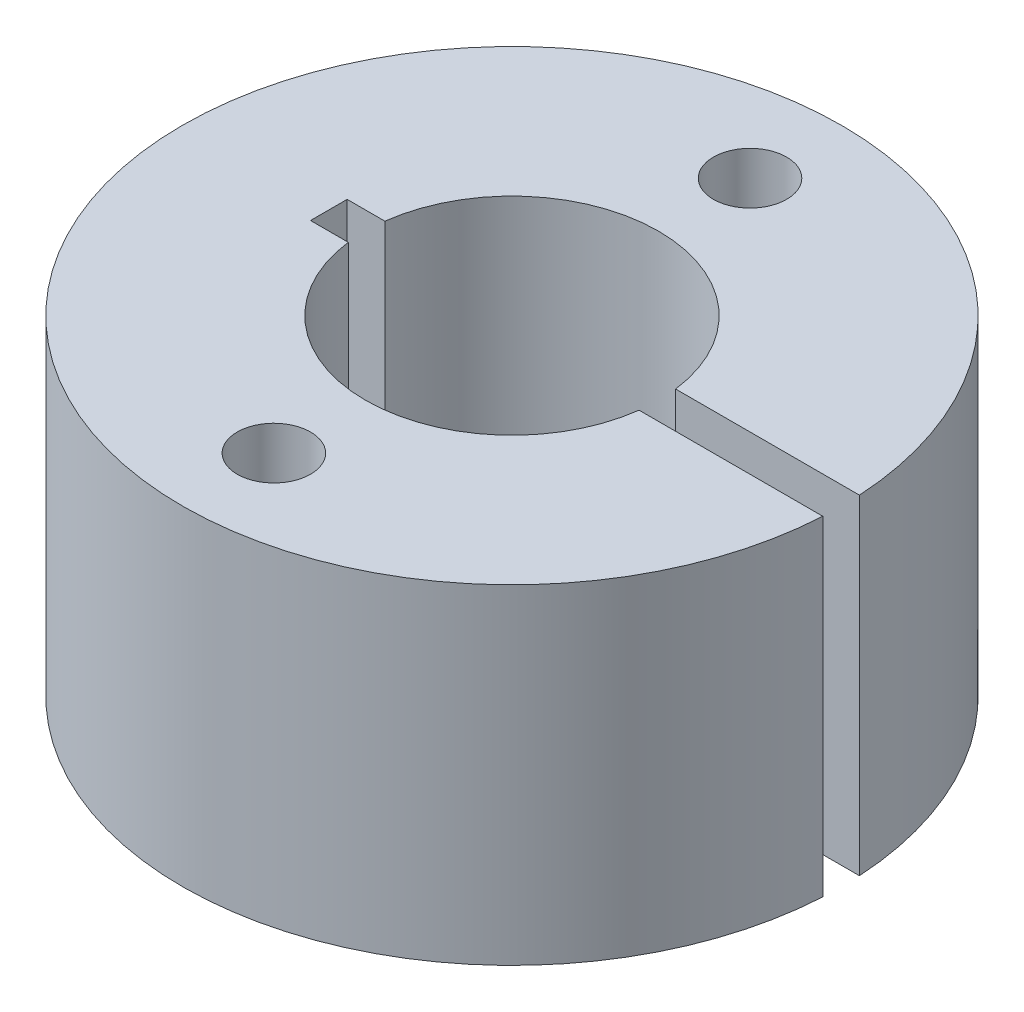
ISO-10303-21;
HEADER;
FILE_DESCRIPTION(('STEP AP214'),'2;1');
FILE_NAME('part.step','',(''),(''),'','','');
FILE_SCHEMA(('AUTOMOTIVE_DESIGN { 1 0 10303 214 1 1 1 1 }'));
ENDSEC;
DATA;
#1=APPLICATION_CONTEXT('core data for automotive mechanical design processes');
#2=APPLICATION_PROTOCOL_DEFINITION('international standard','automotive_design',2000,#1);
#3=PRODUCT_CONTEXT('',#1,'mechanical');
#4=PRODUCT('Part','Part','',(#3));
#5=PRODUCT_RELATED_PRODUCT_CATEGORY('part','',(#4));
#6=PRODUCT_DEFINITION_FORMATION('','',#4);
#7=PRODUCT_DEFINITION_CONTEXT('part definition',#1,'design');
#8=PRODUCT_DEFINITION('design','',#6,#7);
#9=PRODUCT_DEFINITION_SHAPE('','',#8);
#10=(LENGTH_UNIT() NAMED_UNIT(*) SI_UNIT(.MILLI.,.METRE.));
#11=(NAMED_UNIT(*) PLANE_ANGLE_UNIT() SI_UNIT($,.RADIAN.));
#12=(NAMED_UNIT(*) SI_UNIT($,.STERADIAN.) SOLID_ANGLE_UNIT());
#13=UNCERTAINTY_MEASURE_WITH_UNIT(LENGTH_MEASURE(1.E-05),#10,'distance_accuracy_value','');
#14=(GEOMETRIC_REPRESENTATION_CONTEXT(3) GLOBAL_UNCERTAINTY_ASSIGNED_CONTEXT((#13)) GLOBAL_UNIT_ASSIGNED_CONTEXT((#10,
#11,#12)) REPRESENTATION_CONTEXT('',''));
#15=CARTESIAN_POINT('',(0.,0.,0.));
#16=DIRECTION('',(0.,0.,1.));
#17=DIRECTION('',(1.,0.,0.));
#18=AXIS2_PLACEMENT_3D('',#15,#16,#17);
#19=CARTESIAN_POINT('',(0.,9.,0.));
#20=DIRECTION('',(0.,-1.,0.));
#21=DIRECTION('',(0.,0.,-1.));
#22=AXIS2_PLACEMENT_3D('',#19,#20,#21);
#23=CYLINDRICAL_SURFACE('',#22,4.);
#24=CARTESIAN_POINT('',(0.,0.,0.));
#25=DIRECTION('',(0.,-1.,0.));
#26=DIRECTION('',(0.,0.,1.));
#27=AXIS2_PLACEMENT_3D('',#24,#25,#26);
#28=CIRCLE('',#27,4.);
#29=CARTESIAN_POINT('',(3.96862696659689,0.,0.5));
#30=VERTEX_POINT('',#29);
#31=CARTESIAN_POINT('',(-3.96862696659689,0.,0.5));
#32=VERTEX_POINT('',#31);
#33=EDGE_CURVE('E129',#30,#32,#28,.T.);
#34=ORIENTED_EDGE('',*,*,#33,.T.);
#35=DIRECTION('',(0.,-1.,0.));
#36=VECTOR('',#35,1.);
#37=CARTESIAN_POINT('',(-3.96862696659689,9.,0.5));
#38=LINE('',#37,#36);
#39=CARTESIAN_POINT('',(-3.96862696659689,9.,0.5));
#40=VERTEX_POINT('',#39);
#41=EDGE_CURVE('E11',#40,#32,#38,.T.);
#42=ORIENTED_EDGE('',*,*,#41,.F.);
#43=CARTESIAN_POINT('',(0.,9.,0.));
#44=DIRECTION('',(0.,-1.,0.));
#45=DIRECTION('',(0.,0.,1.));
#46=AXIS2_PLACEMENT_3D('',#43,#44,#45);
#47=CIRCLE('',#46,4.);
#48=CARTESIAN_POINT('',(3.96862696659689,9.,0.5));
#49=VERTEX_POINT('',#48);
#50=EDGE_CURVE('E144',#49,#40,#47,.T.);
#51=ORIENTED_EDGE('',*,*,#50,.F.);
#52=DIRECTION('',(0.,-1.,0.));
#53=VECTOR('',#52,1.);
#54=CARTESIAN_POINT('',(3.96862696659689,9.,0.5));
#55=LINE('',#54,#53);
#56=EDGE_CURVE('E125',#49,#30,#55,.T.);
#57=ORIENTED_EDGE('',*,*,#56,.T.);
#58=EDGE_LOOP('',(#34,#42,#51,#57));
#59=FACE_BOUND('',#58,.T.);
#60=ADVANCED_FACE('F33',(#59),#23,.F.);
#61=CARTESIAN_POINT('',(-5.,9.,0.5));
#62=DIRECTION('',(0.,0.,1.));
#63=DIRECTION('',(1.,0.,0.));
#64=AXIS2_PLACEMENT_3D('',#61,#62,#63);
#65=PLANE('',#64);
#66=DIRECTION('',(-1.,0.,0.));
#67=VECTOR('',#66,1.);
#68=CARTESIAN_POINT('',(-5.,0.,0.5));
#69=LINE('',#68,#67);
#70=CARTESIAN_POINT('',(-5.,0.,0.5));
#71=VERTEX_POINT('',#70);
#72=EDGE_CURVE('E132',#32,#71,#69,.T.);
#73=ORIENTED_EDGE('',*,*,#72,.T.);
#74=DIRECTION('',(0.,-1.,0.));
#75=VECTOR('',#74,1.);
#76=CARTESIAN_POINT('',(-5.,9.,0.5));
#77=LINE('',#76,#75);
#78=CARTESIAN_POINT('',(-5.,9.,0.5));
#79=VERTEX_POINT('',#78);
#80=EDGE_CURVE('E41',#79,#71,#77,.T.);
#81=ORIENTED_EDGE('',*,*,#80,.F.);
#82=DIRECTION('',(-1.,0.,0.));
#83=VECTOR('',#82,1.);
#84=CARTESIAN_POINT('',(-5.,9.,0.5));
#85=LINE('',#84,#83);
#86=EDGE_CURVE('E92',#40,#79,#85,.T.);
#87=ORIENTED_EDGE('',*,*,#86,.F.);
#88=ORIENTED_EDGE('',*,*,#41,.T.);
#89=EDGE_LOOP('',(#73,#81,#87,#88));
#90=FACE_BOUND('',#89,.T.);
#91=ADVANCED_FACE('F213',(#90),#65,.F.);
#92=CARTESIAN_POINT('',(-5.,9.,-0.5));
#93=DIRECTION('',(-1.,0.,0.));
#94=DIRECTION('',(0.,0.,1.));
#95=AXIS2_PLACEMENT_3D('',#92,#93,#94);
#96=PLANE('',#95);
#97=DIRECTION('',(0.,0.,-1.));
#98=VECTOR('',#97,1.);
#99=CARTESIAN_POINT('',(-5.,0.,-0.5));
#100=LINE('',#99,#98);
#101=CARTESIAN_POINT('',(-5.,0.,-0.5));
#102=VERTEX_POINT('',#101);
#103=EDGE_CURVE('E135',#71,#102,#100,.T.);
#104=ORIENTED_EDGE('',*,*,#103,.T.);
#105=DIRECTION('',(0.,-1.,0.));
#106=VECTOR('',#105,1.);
#107=CARTESIAN_POINT('',(-5.,9.,-0.5));
#108=LINE('',#107,#106);
#109=CARTESIAN_POINT('',(-5.,9.,-0.5));
#110=VERTEX_POINT('',#109);
#111=EDGE_CURVE('E151',#110,#102,#108,.T.);
#112=ORIENTED_EDGE('',*,*,#111,.F.);
#113=DIRECTION('',(0.,0.,-1.));
#114=VECTOR('',#113,1.);
#115=CARTESIAN_POINT('',(-5.,9.,-0.5));
#116=LINE('',#115,#114);
#117=EDGE_CURVE('E159',#79,#110,#116,.T.);
#118=ORIENTED_EDGE('',*,*,#117,.F.);
#119=ORIENTED_EDGE('',*,*,#80,.T.);
#120=EDGE_LOOP('',(#104,#112,#118,#119));
#121=FACE_BOUND('',#120,.T.);
#122=ADVANCED_FACE('F157',(#121),#96,.F.);
#123=CARTESIAN_POINT('',(-5.,9.,-0.5));
#124=DIRECTION('',(0.,0.,-1.));
#125=DIRECTION('',(-1.,0.,0.));
#126=AXIS2_PLACEMENT_3D('',#123,#124,#125);
#127=PLANE('',#126);
#128=DIRECTION('',(1.,0.,0.));
#129=VECTOR('',#128,1.);
#130=CARTESIAN_POINT('',(-5.,0.,-0.5));
#131=LINE('',#130,#129);
#132=CARTESIAN_POINT('',(-3.96862696659689,0.,-0.500000000000001));
#133=VERTEX_POINT('',#132);
#134=EDGE_CURVE('E137',#102,#133,#131,.T.);
#135=ORIENTED_EDGE('',*,*,#134,.T.);
#136=DIRECTION('',(0.,-1.,0.));
#137=VECTOR('',#136,1.);
#138=CARTESIAN_POINT('',(-3.96862696659689,9.,-0.500000000000001));
#139=LINE('',#138,#137);
#140=CARTESIAN_POINT('',(-3.96862696659689,9.,-0.500000000000001));
#141=VERTEX_POINT('',#140);
#142=EDGE_CURVE('E148',#141,#133,#139,.T.);
#143=ORIENTED_EDGE('',*,*,#142,.F.);
#144=DIRECTION('',(1.,0.,0.));
#145=VECTOR('',#144,1.);
#146=CARTESIAN_POINT('',(-5.,9.,-0.5));
#147=LINE('',#146,#145);
#148=EDGE_CURVE('E171',#110,#141,#147,.T.);
#149=ORIENTED_EDGE('',*,*,#148,.F.);
#150=ORIENTED_EDGE('',*,*,#111,.T.);
#151=EDGE_LOOP('',(#135,#143,#149,#150));
#152=FACE_BOUND('',#151,.T.);
#153=ADVANCED_FACE('F167',(#152),#127,.F.);
#154=CARTESIAN_POINT('',(0.,9.,0.));
#155=DIRECTION('',(0.,-1.,0.));
#156=DIRECTION('',(0.,0.,-1.));
#157=AXIS2_PLACEMENT_3D('',#154,#155,#156);
#158=CYLINDRICAL_SURFACE('',#157,4.);
#159=CARTESIAN_POINT('',(0.,0.,0.));
#160=DIRECTION('',(0.,-1.,0.));
#161=DIRECTION('',(0.,0.,1.));
#162=AXIS2_PLACEMENT_3D('',#159,#160,#161);
#163=CIRCLE('',#162,4.);
#164=CARTESIAN_POINT('',(3.96862696659689,0.,-0.5));
#165=VERTEX_POINT('',#164);
#166=EDGE_CURVE('E139',#133,#165,#163,.T.);
#167=ORIENTED_EDGE('',*,*,#166,.T.);
#168=DIRECTION('',(0.,-1.,0.));
#169=VECTOR('',#168,1.);
#170=CARTESIAN_POINT('',(3.96862696659689,9.,-0.5));
#171=LINE('',#170,#169);
#172=CARTESIAN_POINT('',(3.96862696659689,9.,-0.5));
#173=VERTEX_POINT('',#172);
#174=EDGE_CURVE('E120',#173,#165,#171,.T.);
#175=ORIENTED_EDGE('',*,*,#174,.F.);
#176=CARTESIAN_POINT('',(0.,9.,0.));
#177=DIRECTION('',(0.,-1.,0.));
#178=DIRECTION('',(0.,0.,1.));
#179=AXIS2_PLACEMENT_3D('',#176,#177,#178);
#180=CIRCLE('',#179,4.);
#181=EDGE_CURVE('E111',#141,#173,#180,.T.);
#182=ORIENTED_EDGE('',*,*,#181,.F.);
#183=ORIENTED_EDGE('',*,*,#142,.T.);
#184=EDGE_LOOP('',(#167,#175,#182,#183));
#185=FACE_BOUND('',#184,.T.);
#186=ADVANCED_FACE('F170',(#185),#158,.F.);
#187=CARTESIAN_POINT('',(3.96862696659689,9.,-0.5));
#188=DIRECTION('',(0.,0.,-1.));
#189=DIRECTION('',(-1.,0.,0.));
#190=AXIS2_PLACEMENT_3D('',#187,#188,#189);
#191=PLANE('',#190);
#192=DIRECTION('',(1.,0.,0.));
#193=VECTOR('',#192,1.);
#194=CARTESIAN_POINT('',(3.96862696659689,0.,-0.5));
#195=LINE('',#194,#193);
#196=CARTESIAN_POINT('',(8.98610037780572,0.,-0.499999999999999));
#197=VERTEX_POINT('',#196);
#198=EDGE_CURVE('E119',#165,#197,#195,.T.);
#199=ORIENTED_EDGE('',*,*,#198,.T.);
#200=DIRECTION('',(0.,-1.,0.));
#201=VECTOR('',#200,1.);
#202=CARTESIAN_POINT('',(8.98610037780572,9.,-0.499999999999999));
#203=LINE('',#202,#201);
#204=CARTESIAN_POINT('',(8.98610037780572,9.,-0.499999999999999));
#205=VERTEX_POINT('',#204);
#206=EDGE_CURVE('E116',#205,#197,#203,.T.);
#207=ORIENTED_EDGE('',*,*,#206,.F.);
#208=DIRECTION('',(1.,0.,0.));
#209=VECTOR('',#208,1.);
#210=CARTESIAN_POINT('',(3.96862696659689,9.,-0.5));
#211=LINE('',#210,#209);
#212=EDGE_CURVE('E105',#173,#205,#211,.T.);
#213=ORIENTED_EDGE('',*,*,#212,.F.);
#214=ORIENTED_EDGE('',*,*,#174,.T.);
#215=EDGE_LOOP('',(#199,#207,#213,#214));
#216=FACE_BOUND('',#215,.T.);
#217=ADVANCED_FACE('F117',(#216),#191,.F.);
#218=CARTESIAN_POINT('',(0.,9.,0.));
#219=DIRECTION('',(0.,-1.,0.));
#220=DIRECTION('',(0.,0.,-1.));
#221=AXIS2_PLACEMENT_3D('',#218,#219,#220);
#222=CYLINDRICAL_SURFACE('',#221,9.);
#223=CARTESIAN_POINT('',(0.,0.,0.));
#224=DIRECTION('',(0.,1.,0.));
#225=DIRECTION('',(0.,0.,1.));
#226=AXIS2_PLACEMENT_3D('',#223,#224,#225);
#227=CIRCLE('',#226,9.);
#228=CARTESIAN_POINT('',(8.98610037780571,0.,0.5));
#229=VERTEX_POINT('',#228);
#230=EDGE_CURVE('E78',#197,#229,#227,.T.);
#231=ORIENTED_EDGE('',*,*,#230,.T.);
#232=DIRECTION('',(0.,-1.,0.));
#233=VECTOR('',#232,1.);
#234=CARTESIAN_POINT('',(8.98610037780571,9.,0.5));
#235=LINE('',#234,#233);
#236=CARTESIAN_POINT('',(8.98610037780571,9.,0.5));
#237=VERTEX_POINT('',#236);
#238=EDGE_CURVE('E121',#237,#229,#235,.T.);
#239=ORIENTED_EDGE('',*,*,#238,.F.);
#240=CARTESIAN_POINT('',(0.,9.,0.));
#241=DIRECTION('',(0.,1.,0.));
#242=DIRECTION('',(0.,0.,1.));
#243=AXIS2_PLACEMENT_3D('',#240,#241,#242);
#244=CIRCLE('',#243,9.);
#245=EDGE_CURVE('E109',#205,#237,#244,.T.);
#246=ORIENTED_EDGE('',*,*,#245,.F.);
#247=ORIENTED_EDGE('',*,*,#206,.T.);
#248=EDGE_LOOP('',(#231,#239,#246,#247));
#249=FACE_BOUND('',#248,.T.);
#250=ADVANCED_FACE('F123',(#249),#222,.T.);
#251=CARTESIAN_POINT('',(3.96862696659689,9.,0.5));
#252=DIRECTION('',(0.,0.,1.));
#253=DIRECTION('',(1.,0.,0.));
#254=AXIS2_PLACEMENT_3D('',#251,#252,#253);
#255=PLANE('',#254);
#256=DIRECTION('',(-1.,0.,0.));
#257=VECTOR('',#256,1.);
#258=CARTESIAN_POINT('',(3.96862696659689,0.,0.5));
#259=LINE('',#258,#257);
#260=EDGE_CURVE('E84',#229,#30,#259,.T.);
#261=ORIENTED_EDGE('',*,*,#260,.T.);
#262=ORIENTED_EDGE('',*,*,#56,.F.);
#263=DIRECTION('',(-1.,0.,0.));
#264=VECTOR('',#263,1.);
#265=CARTESIAN_POINT('',(3.96862696659689,9.,0.5));
#266=LINE('',#265,#264);
#267=EDGE_CURVE('E49',#237,#49,#266,.T.);
#268=ORIENTED_EDGE('',*,*,#267,.F.);
#269=ORIENTED_EDGE('',*,*,#238,.T.);
#270=EDGE_LOOP('',(#261,#262,#268,#269));
#271=FACE_BOUND('',#270,.T.);
#272=ADVANCED_FACE('F200',(#271),#255,.F.);
#273=CARTESIAN_POINT('',(0.,9.,0.));
#274=DIRECTION('',(0.,1.,0.));
#275=DIRECTION('',(0.,0.,1.));
#276=AXIS2_PLACEMENT_3D('',#273,#274,#275);
#277=PLANE('',#276);
#278=CARTESIAN_POINT('',(0.,9.,-6.5));
#279=DIRECTION('',(0.,1.,0.));
#280=DIRECTION('',(0.,0.,1.));
#281=AXIS2_PLACEMENT_3D('',#278,#279,#280);
#282=CIRCLE('',#281,1.);
#283=CARTESIAN_POINT('',(0.,9.,-5.5));
#284=VERTEX_POINT('',#283);
#285=EDGE_CURVE('E183',#284,#284,#282,.T.);
#286=ORIENTED_EDGE('',*,*,#285,.F.);
#287=EDGE_LOOP('',(#286));
#288=FACE_BOUND('',#287,.T.);
#289=CARTESIAN_POINT('',(0.,9.,6.5));
#290=DIRECTION('',(0.,1.,0.));
#291=DIRECTION('',(0.,0.,1.));
#292=AXIS2_PLACEMENT_3D('',#289,#290,#291);
#293=CIRCLE('',#292,1.);
#294=CARTESIAN_POINT('',(0.,9.,7.5));
#295=VERTEX_POINT('',#294);
#296=EDGE_CURVE('E177',#295,#295,#293,.T.);
#297=ORIENTED_EDGE('',*,*,#296,.F.);
#298=EDGE_LOOP('',(#297));
#299=FACE_BOUND('',#298,.T.);
#300=ORIENTED_EDGE('',*,*,#50,.T.);
#301=ORIENTED_EDGE('',*,*,#86,.T.);
#302=ORIENTED_EDGE('',*,*,#117,.T.);
#303=ORIENTED_EDGE('',*,*,#148,.T.);
#304=ORIENTED_EDGE('',*,*,#181,.T.);
#305=ORIENTED_EDGE('',*,*,#212,.T.);
#306=ORIENTED_EDGE('',*,*,#245,.T.);
#307=ORIENTED_EDGE('',*,*,#267,.T.);
#308=EDGE_LOOP('',(#300,#301,#302,#303,#304,#305,#306,#307));
#309=FACE_BOUND('',#308,.T.);
#310=ADVANCED_FACE('F107',(#288,#299,#309),#277,.T.);
#311=CARTESIAN_POINT('',(0.,0.,0.));
#312=DIRECTION('',(0.,1.,0.));
#313=DIRECTION('',(0.,0.,1.));
#314=AXIS2_PLACEMENT_3D('',#311,#312,#313);
#315=PLANE('',#314);
#316=CARTESIAN_POINT('',(0.,0.,-6.5));
#317=DIRECTION('',(0.,1.,0.));
#318=DIRECTION('',(0.,0.,1.));
#319=AXIS2_PLACEMENT_3D('',#316,#317,#318);
#320=CIRCLE('',#319,1.);
#321=CARTESIAN_POINT('',(0.,0.,-5.5));
#322=VERTEX_POINT('',#321);
#323=EDGE_CURVE('E180',#322,#322,#320,.T.);
#324=ORIENTED_EDGE('',*,*,#323,.T.);
#325=EDGE_LOOP('',(#324));
#326=FACE_BOUND('',#325,.T.);
#327=CARTESIAN_POINT('',(0.,0.,6.5));
#328=DIRECTION('',(0.,1.,0.));
#329=DIRECTION('',(0.,0.,1.));
#330=AXIS2_PLACEMENT_3D('',#327,#328,#329);
#331=CIRCLE('',#330,1.);
#332=CARTESIAN_POINT('',(0.,0.,7.5));
#333=VERTEX_POINT('',#332);
#334=EDGE_CURVE('E133',#333,#333,#331,.T.);
#335=ORIENTED_EDGE('',*,*,#334,.T.);
#336=EDGE_LOOP('',(#335));
#337=FACE_BOUND('',#336,.T.);
#338=ORIENTED_EDGE('',*,*,#33,.F.);
#339=ORIENTED_EDGE('',*,*,#260,.F.);
#340=ORIENTED_EDGE('',*,*,#230,.F.);
#341=ORIENTED_EDGE('',*,*,#198,.F.);
#342=ORIENTED_EDGE('',*,*,#166,.F.);
#343=ORIENTED_EDGE('',*,*,#134,.F.);
#344=ORIENTED_EDGE('',*,*,#103,.F.);
#345=ORIENTED_EDGE('',*,*,#72,.F.);
#346=EDGE_LOOP('',(#338,#339,#340,#341,#342,#343,#344,#345));
#347=FACE_BOUND('',#346,.T.);
#348=ADVANCED_FACE('F163',(#326,#337,#347),#315,.F.);
#349=CARTESIAN_POINT('',(0.,0.,6.5));
#350=DIRECTION('',(0.,1.,0.));
#351=DIRECTION('',(0.,0.,1.));
#352=AXIS2_PLACEMENT_3D('',#349,#350,#351);
#353=CYLINDRICAL_SURFACE('',#352,1.);
#354=ORIENTED_EDGE('',*,*,#334,.F.);
#355=EDGE_LOOP('',(#354));
#356=FACE_BOUND('',#355,.T.);
#357=ORIENTED_EDGE('',*,*,#296,.T.);
#358=EDGE_LOOP('',(#357));
#359=FACE_BOUND('',#358,.T.);
#360=ADVANCED_FACE('F194',(#356,#359),#353,.F.);
#361=CARTESIAN_POINT('',(0.,0.,-6.5));
#362=DIRECTION('',(0.,1.,0.));
#363=DIRECTION('',(0.,0.,1.));
#364=AXIS2_PLACEMENT_3D('',#361,#362,#363);
#365=CYLINDRICAL_SURFACE('',#364,1.);
#366=ORIENTED_EDGE('',*,*,#323,.F.);
#367=EDGE_LOOP('',(#366));
#368=FACE_BOUND('',#367,.T.);
#369=ORIENTED_EDGE('',*,*,#285,.T.);
#370=EDGE_LOOP('',(#369));
#371=FACE_BOUND('',#370,.T.);
#372=ADVANCED_FACE('F191',(#368,#371),#365,.F.);
#373=CLOSED_SHELL('',(#60,#91,#122,#153,#186,#217,#250,#272,#310,#348,#360,#372));
#374=MANIFOLD_SOLID_BREP('B2',#373);
#375=ADVANCED_BREP_SHAPE_REPRESENTATION('',(#18,#374),#14);
#376=SHAPE_DEFINITION_REPRESENTATION(#9,#375);
ENDSEC;
END-ISO-10303-21;
